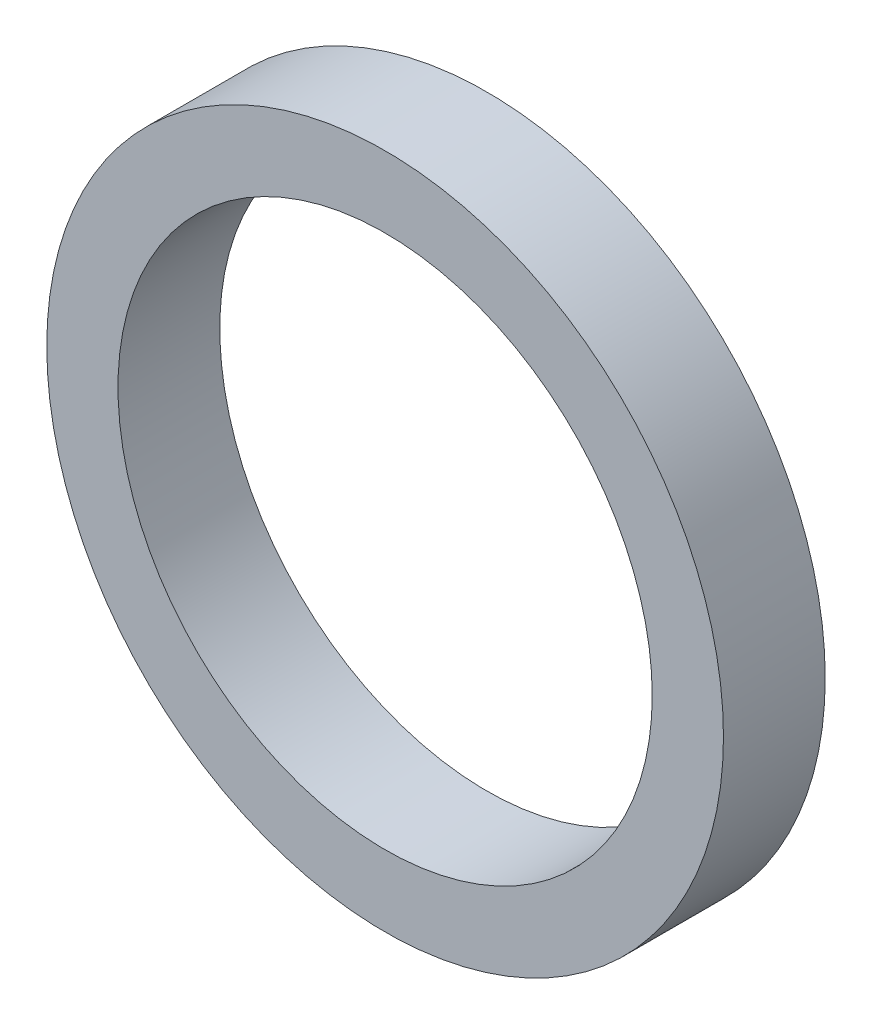
ISO-10303-21;
HEADER;
FILE_DESCRIPTION(('STEP AP214'),'2;1');
FILE_NAME('part.step','',(''),(''),'','','');
FILE_SCHEMA(('AUTOMOTIVE_DESIGN { 1 0 10303 214 1 1 1 1 }'));
ENDSEC;
DATA;
#1=APPLICATION_CONTEXT('core data for automotive mechanical design processes');
#2=APPLICATION_PROTOCOL_DEFINITION('international standard','automotive_design',2000,#1);
#3=PRODUCT_CONTEXT('',#1,'mechanical');
#4=PRODUCT('Part','Part','',(#3));
#5=PRODUCT_RELATED_PRODUCT_CATEGORY('part','',(#4));
#6=PRODUCT_DEFINITION_FORMATION('','',#4);
#7=PRODUCT_DEFINITION_CONTEXT('part definition',#1,'design');
#8=PRODUCT_DEFINITION('design','',#6,#7);
#9=PRODUCT_DEFINITION_SHAPE('','',#8);
#10=(LENGTH_UNIT() NAMED_UNIT(*) SI_UNIT(.MILLI.,.METRE.));
#11=(NAMED_UNIT(*) PLANE_ANGLE_UNIT() SI_UNIT($,.RADIAN.));
#12=(NAMED_UNIT(*) SI_UNIT($,.STERADIAN.) SOLID_ANGLE_UNIT());
#13=UNCERTAINTY_MEASURE_WITH_UNIT(LENGTH_MEASURE(1.E-05),#10,'distance_accuracy_value','');
#14=(GEOMETRIC_REPRESENTATION_CONTEXT(3) GLOBAL_UNCERTAINTY_ASSIGNED_CONTEXT((#13)) GLOBAL_UNIT_ASSIGNED_CONTEXT((#10,
#11,#12)) REPRESENTATION_CONTEXT('',''));
#15=CARTESIAN_POINT('',(0.,0.,0.));
#16=DIRECTION('',(0.,0.,1.));
#17=DIRECTION('',(1.,0.,0.));
#18=AXIS2_PLACEMENT_3D('',#15,#16,#17);
#19=CARTESIAN_POINT('',(33.,0.,4.));
#20=DIRECTION('',(0.,0.,1.));
#21=DIRECTION('',(1.,0.,0.));
#22=AXIS2_PLACEMENT_3D('',#19,#20,#21);
#23=PLANE('',#22);
#24=CARTESIAN_POINT('',(33.,0.,4.));
#25=DIRECTION('',(0.,0.,1.));
#26=DIRECTION('',(1.,0.,0.));
#27=AXIS2_PLACEMENT_3D('',#24,#25,#26);
#28=CIRCLE('',#27,3.325);
#29=CARTESIAN_POINT('',(36.325,0.,4.));
#30=VERTEX_POINT('',#29);
#31=EDGE_CURVE('E10',#30,#30,#28,.T.);
#32=ORIENTED_EDGE('',*,*,#31,.T.);
#33=EDGE_LOOP('',(#32));
#34=FACE_BOUND('',#33,.T.);
#35=CARTESIAN_POINT('',(33.,0.,4.));
#36=DIRECTION('',(0.,0.,1.));
#37=DIRECTION('',(1.,0.,0.));
#38=AXIS2_PLACEMENT_3D('',#35,#36,#37);
#39=CIRCLE('',#38,2.625);
#40=CARTESIAN_POINT('',(35.625,0.,4.));
#41=VERTEX_POINT('',#40);
#42=EDGE_CURVE('E48',#41,#41,#39,.T.);
#43=ORIENTED_EDGE('',*,*,#42,.F.);
#44=EDGE_LOOP('',(#43));
#45=FACE_BOUND('',#44,.T.);
#46=ADVANCED_FACE('F37',(#34,#45),#23,.T.);
#47=CARTESIAN_POINT('',(33.,0.,3.));
#48=DIRECTION('',(0.,0.,1.));
#49=DIRECTION('',(1.,0.,0.));
#50=AXIS2_PLACEMENT_3D('',#47,#48,#49);
#51=PLANE('',#50);
#52=CARTESIAN_POINT('',(33.,0.,3.));
#53=DIRECTION('',(0.,0.,1.));
#54=DIRECTION('',(1.,0.,0.));
#55=AXIS2_PLACEMENT_3D('',#52,#53,#54);
#56=CIRCLE('',#55,3.325);
#57=CARTESIAN_POINT('',(36.325,0.,3.));
#58=VERTEX_POINT('',#57);
#59=EDGE_CURVE('E41',#58,#58,#56,.T.);
#60=ORIENTED_EDGE('',*,*,#59,.F.);
#61=EDGE_LOOP('',(#60));
#62=FACE_BOUND('',#61,.T.);
#63=CARTESIAN_POINT('',(33.,0.,3.));
#64=DIRECTION('',(0.,0.,1.));
#65=DIRECTION('',(1.,0.,0.));
#66=AXIS2_PLACEMENT_3D('',#63,#64,#65);
#67=CIRCLE('',#66,2.625);
#68=CARTESIAN_POINT('',(35.625,0.,3.));
#69=VERTEX_POINT('',#68);
#70=EDGE_CURVE('E50',#69,#69,#67,.T.);
#71=ORIENTED_EDGE('',*,*,#70,.T.);
#72=EDGE_LOOP('',(#71));
#73=FACE_BOUND('',#72,.T.);
#74=ADVANCED_FACE('F60',(#62,#73),#51,.F.);
#75=CARTESIAN_POINT('',(33.,0.,4.));
#76=DIRECTION('',(0.,0.,-1.));
#77=DIRECTION('',(-1.,0.,0.));
#78=AXIS2_PLACEMENT_3D('',#75,#76,#77);
#79=CYLINDRICAL_SURFACE('',#78,3.325);
#80=ORIENTED_EDGE('',*,*,#31,.F.);
#81=EDGE_LOOP('',(#80));
#82=FACE_BOUND('',#81,.T.);
#83=ORIENTED_EDGE('',*,*,#59,.T.);
#84=EDGE_LOOP('',(#83));
#85=FACE_BOUND('',#84,.T.);
#86=ADVANCED_FACE('F39',(#82,#85),#79,.T.);
#87=CARTESIAN_POINT('',(33.,0.,4.));
#88=DIRECTION('',(0.,0.,-1.));
#89=DIRECTION('',(-1.,0.,0.));
#90=AXIS2_PLACEMENT_3D('',#87,#88,#89);
#91=CYLINDRICAL_SURFACE('',#90,2.625);
#92=ORIENTED_EDGE('',*,*,#42,.T.);
#93=EDGE_LOOP('',(#92));
#94=FACE_BOUND('',#93,.T.);
#95=ORIENTED_EDGE('',*,*,#70,.F.);
#96=EDGE_LOOP('',(#95));
#97=FACE_BOUND('',#96,.T.);
#98=ADVANCED_FACE('F56',(#94,#97),#91,.F.);
#99=CLOSED_SHELL('',(#46,#74,#86,#98));
#100=MANIFOLD_SOLID_BREP('B2',#99);
#101=ADVANCED_BREP_SHAPE_REPRESENTATION('',(#18,#100),#14);
#102=SHAPE_DEFINITION_REPRESENTATION(#9,#101);
ENDSEC;
END-ISO-10303-21;
